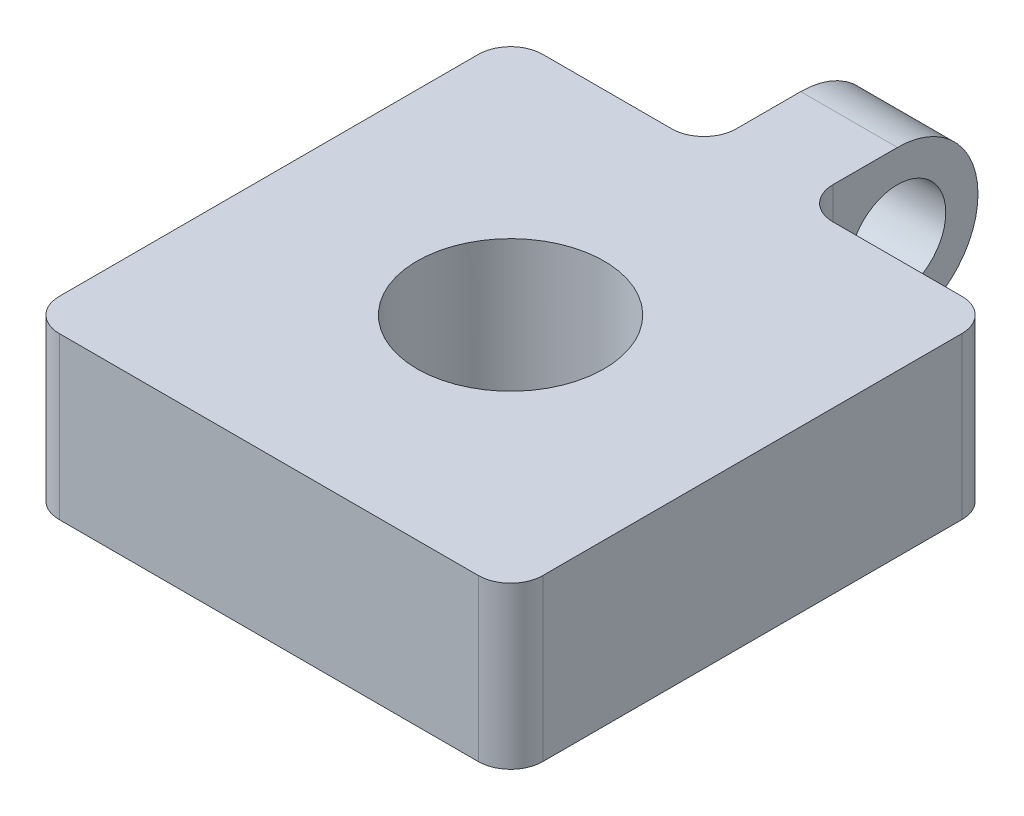
ISO-10303-21;
HEADER;
FILE_DESCRIPTION(('STEP AP214'),'2;1');
FILE_NAME('part.step','',(''),(''),'','','');
FILE_SCHEMA(('AUTOMOTIVE_DESIGN { 1 0 10303 214 1 1 1 1 }'));
ENDSEC;
DATA;
#1=APPLICATION_CONTEXT('core data for automotive mechanical design processes');
#2=APPLICATION_PROTOCOL_DEFINITION('international standard','automotive_design',2000,#1);
#3=PRODUCT_CONTEXT('',#1,'mechanical');
#4=PRODUCT('Part','Part','',(#3));
#5=PRODUCT_RELATED_PRODUCT_CATEGORY('part','',(#4));
#6=PRODUCT_DEFINITION_FORMATION('','',#4);
#7=PRODUCT_DEFINITION_CONTEXT('part definition',#1,'design');
#8=PRODUCT_DEFINITION('design','',#6,#7);
#9=PRODUCT_DEFINITION_SHAPE('','',#8);
#10=(LENGTH_UNIT() NAMED_UNIT(*) SI_UNIT(.MILLI.,.METRE.));
#11=(NAMED_UNIT(*) PLANE_ANGLE_UNIT() SI_UNIT($,.RADIAN.));
#12=(NAMED_UNIT(*) SI_UNIT($,.STERADIAN.) SOLID_ANGLE_UNIT());
#13=UNCERTAINTY_MEASURE_WITH_UNIT(LENGTH_MEASURE(1.E-05),#10,'distance_accuracy_value','');
#14=(GEOMETRIC_REPRESENTATION_CONTEXT(3) GLOBAL_UNCERTAINTY_ASSIGNED_CONTEXT((#13)) GLOBAL_UNIT_ASSIGNED_CONTEXT((#10,
#11,#12)) REPRESENTATION_CONTEXT('',''));
#15=CARTESIAN_POINT('',(0.,0.,0.));
#16=DIRECTION('',(0.,0.,1.));
#17=DIRECTION('',(1.,0.,0.));
#18=AXIS2_PLACEMENT_3D('',#15,#16,#17);
#19=CARTESIAN_POINT('',(-7.5,5.,-7.5));
#20=DIRECTION('',(0.,0.,1.));
#21=DIRECTION('',(1.,0.,0.));
#22=AXIS2_PLACEMENT_3D('',#19,#20,#21);
#23=PLANE('',#22);
#24=DIRECTION('',(-1.,0.,0.));
#25=VECTOR('',#24,1.);
#26=CARTESIAN_POINT('',(-7.5,5.,-7.5));
#27=LINE('',#26,#25);
#28=CARTESIAN_POINT('',(6.5,5.,-7.5));
#29=VERTEX_POINT('',#28);
#30=CARTESIAN_POINT('',(2.5,5.,-7.5));
#31=VERTEX_POINT('',#30);
#32=EDGE_CURVE('E183',#29,#31,#27,.T.);
#33=ORIENTED_EDGE('',*,*,#32,.F.);
#34=DIRECTION('',(0.,-1.,0.));
#35=VECTOR('',#34,1.);
#36=CARTESIAN_POINT('',(6.5,5.,-7.5));
#37=LINE('',#36,#35);
#38=CARTESIAN_POINT('',(6.5,0.,-7.5));
#39=VERTEX_POINT('',#38);
#40=EDGE_CURVE('E236',#29,#39,#37,.T.);
#41=ORIENTED_EDGE('',*,*,#40,.T.);
#42=DIRECTION('',(-1.,0.,0.));
#43=VECTOR('',#42,1.);
#44=CARTESIAN_POINT('',(-7.5,0.,-7.5));
#45=LINE('',#44,#43);
#46=CARTESIAN_POINT('',(2.5,0.,-7.5));
#47=VERTEX_POINT('',#46);
#48=EDGE_CURVE('E194',#39,#47,#45,.T.);
#49=ORIENTED_EDGE('',*,*,#48,.T.);
#50=DIRECTION('',(0.,-1.,0.));
#51=VECTOR('',#50,1.);
#52=CARTESIAN_POINT('',(2.5,5.,-7.5));
#53=LINE('',#52,#51);
#54=EDGE_CURVE('E234',#47,#31,#53,.F.);
#55=ORIENTED_EDGE('',*,*,#54,.T.);
#56=EDGE_LOOP('',(#33,#41,#49,#55));
#57=FACE_BOUND('',#56,.T.);
#58=ADVANCED_FACE('F37',(#57),#23,.F.);
#59=CARTESIAN_POINT('',(7.5,5.,7.5));
#60=DIRECTION('',(-1.,0.,0.));
#61=DIRECTION('',(0.,0.,1.));
#62=AXIS2_PLACEMENT_3D('',#59,#60,#61);
#63=PLANE('',#62);
#64=DIRECTION('',(0.,0.,-1.));
#65=VECTOR('',#64,1.);
#66=CARTESIAN_POINT('',(7.5,5.,7.5));
#67=LINE('',#66,#65);
#68=CARTESIAN_POINT('',(7.5,5.,6.5));
#69=VERTEX_POINT('',#68);
#70=CARTESIAN_POINT('',(7.5,5.,-6.5));
#71=VERTEX_POINT('',#70);
#72=EDGE_CURVE('E178',#69,#71,#67,.T.);
#73=ORIENTED_EDGE('',*,*,#72,.F.);
#74=DIRECTION('',(0.,-1.,0.));
#75=VECTOR('',#74,1.);
#76=CARTESIAN_POINT('',(7.5,5.,6.5));
#77=LINE('',#76,#75);
#78=CARTESIAN_POINT('',(7.5,0.,6.5));
#79=VERTEX_POINT('',#78);
#80=EDGE_CURVE('E231',#69,#79,#77,.T.);
#81=ORIENTED_EDGE('',*,*,#80,.T.);
#82=DIRECTION('',(0.,0.,-1.));
#83=VECTOR('',#82,1.);
#84=CARTESIAN_POINT('',(7.5,0.,7.5));
#85=LINE('',#84,#83);
#86=CARTESIAN_POINT('',(7.5,0.,-6.5));
#87=VERTEX_POINT('',#86);
#88=EDGE_CURVE('E160',#79,#87,#85,.T.);
#89=ORIENTED_EDGE('',*,*,#88,.T.);
#90=DIRECTION('',(0.,-1.,0.));
#91=VECTOR('',#90,1.);
#92=CARTESIAN_POINT('',(7.5,5.,-6.5));
#93=LINE('',#92,#91);
#94=EDGE_CURVE('E229',#87,#71,#93,.F.);
#95=ORIENTED_EDGE('',*,*,#94,.T.);
#96=EDGE_LOOP('',(#73,#81,#89,#95));
#97=FACE_BOUND('',#96,.T.);
#98=ADVANCED_FACE('F281',(#97),#63,.F.);
#99=CARTESIAN_POINT('',(-2.5,0.,-7.5));
#100=VERTEX_POINT('',#99);
#101=CARTESIAN_POINT('',(-6.5,0.,-7.5));
#102=VERTEX_POINT('',#101);
#103=EDGE_CURVE('E193',#100,#102,#45,.T.);
#104=ORIENTED_EDGE('',*,*,#103,.T.);
#105=DIRECTION('',(0.,-1.,0.));
#106=VECTOR('',#105,1.);
#107=CARTESIAN_POINT('',(-6.5,5.,-7.5));
#108=LINE('',#107,#106);
#109=CARTESIAN_POINT('',(-6.5,5.,-7.5));
#110=VERTEX_POINT('',#109);
#111=EDGE_CURVE('E216',#102,#110,#108,.F.);
#112=ORIENTED_EDGE('',*,*,#111,.T.);
#113=CARTESIAN_POINT('',(-2.5,5.,-7.5));
#114=VERTEX_POINT('',#113);
#115=EDGE_CURVE('E181',#114,#110,#27,.T.);
#116=ORIENTED_EDGE('',*,*,#115,.F.);
#117=DIRECTION('',(0.,-1.,0.));
#118=VECTOR('',#117,1.);
#119=CARTESIAN_POINT('',(-2.5,5.,-7.5));
#120=LINE('',#119,#118);
#121=EDGE_CURVE('E213',#114,#100,#120,.T.);
#122=ORIENTED_EDGE('',*,*,#121,.T.);
#123=EDGE_LOOP('',(#104,#112,#116,#122));
#124=FACE_BOUND('',#123,.T.);
#125=ADVANCED_FACE('F260',(#124),#23,.F.);
#126=CARTESIAN_POINT('',(-7.5,5.,7.5));
#127=DIRECTION('',(1.,0.,0.));
#128=DIRECTION('',(0.,0.,-1.));
#129=AXIS2_PLACEMENT_3D('',#126,#127,#128);
#130=PLANE('',#129);
#131=DIRECTION('',(0.,0.,1.));
#132=VECTOR('',#131,1.);
#133=CARTESIAN_POINT('',(-7.5,5.,7.5));
#134=LINE('',#133,#132);
#135=CARTESIAN_POINT('',(-7.5,5.,-6.5));
#136=VERTEX_POINT('',#135);
#137=CARTESIAN_POINT('',(-7.5,5.,6.5));
#138=VERTEX_POINT('',#137);
#139=EDGE_CURVE('E186',#136,#138,#134,.T.);
#140=ORIENTED_EDGE('',*,*,#139,.F.);
#141=DIRECTION('',(0.,-1.,0.));
#142=VECTOR('',#141,1.);
#143=CARTESIAN_POINT('',(-7.5,5.,-6.5));
#144=LINE('',#143,#142);
#145=CARTESIAN_POINT('',(-7.5,0.,-6.5));
#146=VERTEX_POINT('',#145);
#147=EDGE_CURVE('E202',#136,#146,#144,.T.);
#148=ORIENTED_EDGE('',*,*,#147,.T.);
#149=DIRECTION('',(0.,0.,1.));
#150=VECTOR('',#149,1.);
#151=CARTESIAN_POINT('',(-7.5,0.,7.5));
#152=LINE('',#151,#150);
#153=CARTESIAN_POINT('',(-7.5,0.,6.5));
#154=VERTEX_POINT('',#153);
#155=EDGE_CURVE('E197',#146,#154,#152,.T.);
#156=ORIENTED_EDGE('',*,*,#155,.T.);
#157=DIRECTION('',(0.,-1.,0.));
#158=VECTOR('',#157,1.);
#159=CARTESIAN_POINT('',(-7.5,5.,6.5));
#160=LINE('',#159,#158);
#161=EDGE_CURVE('E190',#154,#138,#160,.F.);
#162=ORIENTED_EDGE('',*,*,#161,.T.);
#163=EDGE_LOOP('',(#140,#148,#156,#162));
#164=FACE_BOUND('',#163,.T.);
#165=ADVANCED_FACE('F267',(#164),#130,.F.);
#166=CARTESIAN_POINT('',(-7.5,5.,7.5));
#167=DIRECTION('',(0.,0.,-1.));
#168=DIRECTION('',(-1.,0.,0.));
#169=AXIS2_PLACEMENT_3D('',#166,#167,#168);
#170=PLANE('',#169);
#171=DIRECTION('',(1.,0.,0.));
#172=VECTOR('',#171,1.);
#173=CARTESIAN_POINT('',(-7.5,5.,7.5));
#174=LINE('',#173,#172);
#175=CARTESIAN_POINT('',(-6.5,5.,7.5));
#176=VERTEX_POINT('',#175);
#177=CARTESIAN_POINT('',(6.5,5.,7.5));
#178=VERTEX_POINT('',#177);
#179=EDGE_CURVE('E188',#176,#178,#174,.T.);
#180=ORIENTED_EDGE('',*,*,#179,.F.);
#181=DIRECTION('',(0.,-1.,0.));
#182=VECTOR('',#181,1.);
#183=CARTESIAN_POINT('',(-6.5,5.,7.5));
#184=LINE('',#183,#182);
#185=CARTESIAN_POINT('',(-6.5,0.,7.5));
#186=VERTEX_POINT('',#185);
#187=EDGE_CURVE('E226',#176,#186,#184,.T.);
#188=ORIENTED_EDGE('',*,*,#187,.T.);
#189=DIRECTION('',(1.,0.,0.));
#190=VECTOR('',#189,1.);
#191=CARTESIAN_POINT('',(-7.5,0.,7.5));
#192=LINE('',#191,#190);
#193=CARTESIAN_POINT('',(6.5,0.,7.5));
#194=VERTEX_POINT('',#193);
#195=EDGE_CURVE('E182',#186,#194,#192,.T.);
#196=ORIENTED_EDGE('',*,*,#195,.T.);
#197=DIRECTION('',(0.,-1.,0.));
#198=VECTOR('',#197,1.);
#199=CARTESIAN_POINT('',(6.5,5.,7.5));
#200=LINE('',#199,#198);
#201=EDGE_CURVE('E52',#194,#178,#200,.F.);
#202=ORIENTED_EDGE('',*,*,#201,.T.);
#203=EDGE_LOOP('',(#180,#188,#196,#202));
#204=FACE_BOUND('',#203,.T.);
#205=ADVANCED_FACE('F273',(#204),#170,.F.);
#206=CARTESIAN_POINT('',(0.,5.,0.));
#207=DIRECTION('',(0.,-1.,0.));
#208=DIRECTION('',(0.,0.,-1.));
#209=AXIS2_PLACEMENT_3D('',#206,#207,#208);
#210=PLANE('',#209);
#211=CARTESIAN_POINT('',(0.,5.,0.));
#212=DIRECTION('',(0.,1.,0.));
#213=DIRECTION('',(0.,0.,1.));
#214=AXIS2_PLACEMENT_3D('',#211,#212,#213);
#215=CIRCLE('',#214,2.9);
#216=CARTESIAN_POINT('',(0.,5.,2.9));
#217=VERTEX_POINT('',#216);
#218=EDGE_CURVE('E345',#217,#217,#215,.T.);
#219=ORIENTED_EDGE('',*,*,#218,.F.);
#220=EDGE_LOOP('',(#219));
#221=FACE_BOUND('',#220,.T.);
#222=ORIENTED_EDGE('',*,*,#115,.T.);
#223=CARTESIAN_POINT('',(-6.5,5.,-6.5));
#224=DIRECTION('',(0.,-1.,0.));
#225=DIRECTION('',(0.,0.,-1.));
#226=AXIS2_PLACEMENT_3D('',#223,#224,#225);
#227=CIRCLE('',#226,1.);
#228=EDGE_CURVE('E223',#110,#136,#227,.F.);
#229=ORIENTED_EDGE('',*,*,#228,.T.);
#230=ORIENTED_EDGE('',*,*,#139,.T.);
#231=CARTESIAN_POINT('',(-6.5,5.,6.5));
#232=DIRECTION('',(0.,-1.,0.));
#233=DIRECTION('',(0.,0.,-1.));
#234=AXIS2_PLACEMENT_3D('',#231,#232,#233);
#235=CIRCLE('',#234,1.);
#236=EDGE_CURVE('E59',#138,#176,#235,.F.);
#237=ORIENTED_EDGE('',*,*,#236,.T.);
#238=ORIENTED_EDGE('',*,*,#179,.T.);
#239=CARTESIAN_POINT('',(6.5,5.,6.5));
#240=DIRECTION('',(0.,-1.,0.));
#241=DIRECTION('',(0.,0.,-1.));
#242=AXIS2_PLACEMENT_3D('',#239,#240,#241);
#243=CIRCLE('',#242,1.);
#244=EDGE_CURVE('E220',#178,#69,#243,.F.);
#245=ORIENTED_EDGE('',*,*,#244,.T.);
#246=ORIENTED_EDGE('',*,*,#72,.T.);
#247=CARTESIAN_POINT('',(6.5,5.,-6.5));
#248=DIRECTION('',(0.,-1.,0.));
#249=DIRECTION('',(0.,0.,-1.));
#250=AXIS2_PLACEMENT_3D('',#247,#248,#249);
#251=CIRCLE('',#250,1.);
#252=EDGE_CURVE('E218',#71,#29,#251,.F.);
#253=ORIENTED_EDGE('',*,*,#252,.T.);
#254=ORIENTED_EDGE('',*,*,#32,.T.);
#255=CARTESIAN_POINT('',(2.5,5.,-8.5));
#256=DIRECTION('',(0.,-1.,0.));
#257=DIRECTION('',(0.,0.,-1.));
#258=AXIS2_PLACEMENT_3D('',#255,#256,#257);
#259=CIRCLE('',#258,1.);
#260=CARTESIAN_POINT('',(1.5,5.,-8.5));
#261=VERTEX_POINT('',#260);
#262=EDGE_CURVE('E244',#31,#261,#259,.T.);
#263=ORIENTED_EDGE('',*,*,#262,.T.);
#264=DIRECTION('',(0.,0.,1.));
#265=VECTOR('',#264,1.);
#266=CARTESIAN_POINT('',(1.5,5.,-7.5));
#267=LINE('',#266,#265);
#268=CARTESIAN_POINT('',(1.5,5.,-10.5));
#269=VERTEX_POINT('',#268);
#270=EDGE_CURVE('E166',#269,#261,#267,.T.);
#271=ORIENTED_EDGE('',*,*,#270,.F.);
#272=DIRECTION('',(-1.,0.,0.));
#273=VECTOR('',#272,1.);
#274=CARTESIAN_POINT('',(1.5,5.,-10.5));
#275=LINE('',#274,#273);
#276=CARTESIAN_POINT('',(-1.5,5.,-10.5));
#277=VERTEX_POINT('',#276);
#278=EDGE_CURVE('E161',#269,#277,#275,.T.);
#279=ORIENTED_EDGE('',*,*,#278,.T.);
#280=DIRECTION('',(0.,0.,1.));
#281=VECTOR('',#280,1.);
#282=CARTESIAN_POINT('',(-1.5,5.,-7.5));
#283=LINE('',#282,#281);
#284=CARTESIAN_POINT('',(-1.5,5.,-8.5));
#285=VERTEX_POINT('',#284);
#286=EDGE_CURVE('E150',#277,#285,#283,.T.);
#287=ORIENTED_EDGE('',*,*,#286,.T.);
#288=CARTESIAN_POINT('',(-2.5,5.,-8.5));
#289=DIRECTION('',(0.,-1.,0.));
#290=DIRECTION('',(0.,0.,-1.));
#291=AXIS2_PLACEMENT_3D('',#288,#289,#290);
#292=CIRCLE('',#291,1.);
#293=EDGE_CURVE('E11',#285,#114,#292,.T.);
#294=ORIENTED_EDGE('',*,*,#293,.T.);
#295=EDGE_LOOP('',(#222,#229,#230,#237,#238,#245,#246,#253,#254,#263,#271,#279,#287,#294));
#296=FACE_BOUND('',#295,.T.);
#297=ADVANCED_FACE('F257',(#221,#296),#210,.F.);
#298=CARTESIAN_POINT('',(0.,0.,0.));
#299=DIRECTION('',(0.,-1.,0.));
#300=DIRECTION('',(0.,0.,-1.));
#301=AXIS2_PLACEMENT_3D('',#298,#299,#300);
#302=PLANE('',#301);
#303=CARTESIAN_POINT('',(0.,0.,0.));
#304=DIRECTION('',(0.,-1.,0.));
#305=DIRECTION('',(0.,0.,-1.));
#306=AXIS2_PLACEMENT_3D('',#303,#304,#305);
#307=CIRCLE('',#306,2.9);
#308=CARTESIAN_POINT('',(0.,0.,-2.9));
#309=VERTEX_POINT('',#308);
#310=EDGE_CURVE('E342',#309,#309,#307,.F.);
#311=ORIENTED_EDGE('',*,*,#310,.T.);
#312=EDGE_LOOP('',(#311));
#313=FACE_BOUND('',#312,.T.);
#314=ORIENTED_EDGE('',*,*,#155,.F.);
#315=CARTESIAN_POINT('',(-6.5,0.,-6.5));
#316=DIRECTION('',(0.,-1.,0.));
#317=DIRECTION('',(0.,0.,-1.));
#318=AXIS2_PLACEMENT_3D('',#315,#316,#317);
#319=CIRCLE('',#318,1.);
#320=EDGE_CURVE('E211',#146,#102,#319,.T.);
#321=ORIENTED_EDGE('',*,*,#320,.T.);
#322=ORIENTED_EDGE('',*,*,#103,.F.);
#323=CARTESIAN_POINT('',(-2.5,0.,-8.5));
#324=DIRECTION('',(0.,-1.,0.));
#325=DIRECTION('',(0.,0.,-1.));
#326=AXIS2_PLACEMENT_3D('',#323,#324,#325);
#327=CIRCLE('',#326,1.);
#328=CARTESIAN_POINT('',(-1.5,0.,-8.5));
#329=VERTEX_POINT('',#328);
#330=EDGE_CURVE('E45',#100,#329,#327,.F.);
#331=ORIENTED_EDGE('',*,*,#330,.T.);
#332=DIRECTION('',(0.,0.,-1.));
#333=VECTOR('',#332,1.);
#334=CARTESIAN_POINT('',(-1.5,0.,-7.5));
#335=LINE('',#334,#333);
#336=CARTESIAN_POINT('',(-1.5,0.,-10.5));
#337=VERTEX_POINT('',#336);
#338=EDGE_CURVE('E157',#329,#337,#335,.T.);
#339=ORIENTED_EDGE('',*,*,#338,.T.);
#340=DIRECTION('',(-1.,0.,0.));
#341=VECTOR('',#340,1.);
#342=CARTESIAN_POINT('',(1.5,0.,-10.5));
#343=LINE('',#342,#341);
#344=CARTESIAN_POINT('',(1.5,0.,-10.5));
#345=VERTEX_POINT('',#344);
#346=EDGE_CURVE('E153',#345,#337,#343,.T.);
#347=ORIENTED_EDGE('',*,*,#346,.F.);
#348=DIRECTION('',(0.,0.,-1.));
#349=VECTOR('',#348,1.);
#350=CARTESIAN_POINT('',(1.5,0.,-7.5));
#351=LINE('',#350,#349);
#352=CARTESIAN_POINT('',(1.5,0.,-8.5));
#353=VERTEX_POINT('',#352);
#354=EDGE_CURVE('E139',#353,#345,#351,.T.);
#355=ORIENTED_EDGE('',*,*,#354,.F.);
#356=CARTESIAN_POINT('',(2.5,0.,-8.5));
#357=DIRECTION('',(0.,-1.,0.));
#358=DIRECTION('',(0.,0.,-1.));
#359=AXIS2_PLACEMENT_3D('',#356,#357,#358);
#360=CIRCLE('',#359,1.);
#361=EDGE_CURVE('E242',#353,#47,#360,.F.);
#362=ORIENTED_EDGE('',*,*,#361,.T.);
#363=ORIENTED_EDGE('',*,*,#48,.F.);
#364=CARTESIAN_POINT('',(6.5,0.,-6.5));
#365=DIRECTION('',(0.,-1.,0.));
#366=DIRECTION('',(0.,0.,-1.));
#367=AXIS2_PLACEMENT_3D('',#364,#365,#366);
#368=CIRCLE('',#367,1.);
#369=EDGE_CURVE('E205',#39,#87,#368,.T.);
#370=ORIENTED_EDGE('',*,*,#369,.T.);
#371=ORIENTED_EDGE('',*,*,#88,.F.);
#372=CARTESIAN_POINT('',(6.5,0.,6.5));
#373=DIRECTION('',(0.,-1.,0.));
#374=DIRECTION('',(0.,0.,-1.));
#375=AXIS2_PLACEMENT_3D('',#372,#373,#374);
#376=CIRCLE('',#375,1.);
#377=EDGE_CURVE('E207',#79,#194,#376,.T.);
#378=ORIENTED_EDGE('',*,*,#377,.T.);
#379=ORIENTED_EDGE('',*,*,#195,.F.);
#380=CARTESIAN_POINT('',(-6.5,0.,6.5));
#381=DIRECTION('',(0.,-1.,0.));
#382=DIRECTION('',(0.,0.,-1.));
#383=AXIS2_PLACEMENT_3D('',#380,#381,#382);
#384=CIRCLE('',#383,1.);
#385=EDGE_CURVE('E209',#186,#154,#384,.T.);
#386=ORIENTED_EDGE('',*,*,#385,.T.);
#387=EDGE_LOOP('',(#314,#321,#322,#331,#339,#347,#355,#362,#363,#370,#371,#378,#379,#386));
#388=FACE_BOUND('',#387,.T.);
#389=ADVANCED_FACE('F155',(#313,#388),#302,.T.);
#390=CARTESIAN_POINT('',(1.5,2.5,-10.5));
#391=DIRECTION('',(-1.,0.,0.));
#392=DIRECTION('',(0.,0.,1.));
#393=AXIS2_PLACEMENT_3D('',#390,#391,#392);
#394=PLANE('',#393);
#395=ORIENTED_EDGE('',*,*,#270,.T.);
#396=DIRECTION('',(0.,-1.,0.));
#397=VECTOR('',#396,1.);
#398=CARTESIAN_POINT('',(1.5,0.,-8.5));
#399=LINE('',#398,#397);
#400=EDGE_CURVE('E148',#261,#353,#399,.T.);
#401=ORIENTED_EDGE('',*,*,#400,.T.);
#402=ORIENTED_EDGE('',*,*,#354,.T.);
#403=CARTESIAN_POINT('',(1.5,2.5,-10.5));
#404=DIRECTION('',(1.,0.,0.));
#405=DIRECTION('',(0.,0.,1.));
#406=AXIS2_PLACEMENT_3D('',#403,#404,#405);
#407=CIRCLE('',#406,2.5);
#408=EDGE_CURVE('E145',#345,#269,#407,.T.);
#409=ORIENTED_EDGE('',*,*,#408,.T.);
#410=EDGE_LOOP('',(#395,#401,#402,#409));
#411=FACE_BOUND('',#410,.T.);
#412=CARTESIAN_POINT('',(1.5,2.5,-10.5));
#413=DIRECTION('',(1.,0.,0.));
#414=DIRECTION('',(0.,0.,-1.));
#415=AXIS2_PLACEMENT_3D('',#412,#413,#414);
#416=CIRCLE('',#415,1.5);
#417=CARTESIAN_POINT('',(1.5,2.5,-12.));
#418=VERTEX_POINT('',#417);
#419=EDGE_CURVE('E173',#418,#418,#416,.T.);
#420=ORIENTED_EDGE('',*,*,#419,.F.);
#421=EDGE_LOOP('',(#420));
#422=FACE_BOUND('',#421,.T.);
#423=ADVANCED_FACE('F142',(#411,#422),#394,.F.);
#424=CARTESIAN_POINT('',(-1.5,2.5,-10.5));
#425=DIRECTION('',(-1.,0.,0.));
#426=DIRECTION('',(0.,0.,1.));
#427=AXIS2_PLACEMENT_3D('',#424,#425,#426);
#428=PLANE('',#427);
#429=ORIENTED_EDGE('',*,*,#338,.F.);
#430=DIRECTION('',(0.,-1.,0.));
#431=VECTOR('',#430,1.);
#432=CARTESIAN_POINT('',(-1.5,2.5,-8.5));
#433=LINE('',#432,#431);
#434=EDGE_CURVE('E240',#329,#285,#433,.F.);
#435=ORIENTED_EDGE('',*,*,#434,.T.);
#436=ORIENTED_EDGE('',*,*,#286,.F.);
#437=CARTESIAN_POINT('',(-1.5,2.5,-10.5));
#438=DIRECTION('',(1.,0.,0.));
#439=DIRECTION('',(0.,0.,1.));
#440=AXIS2_PLACEMENT_3D('',#437,#438,#439);
#441=CIRCLE('',#440,2.5);
#442=EDGE_CURVE('E172',#337,#277,#441,.T.);
#443=ORIENTED_EDGE('',*,*,#442,.F.);
#444=EDGE_LOOP('',(#429,#435,#436,#443));
#445=FACE_BOUND('',#444,.T.);
#446=CARTESIAN_POINT('',(-1.5,2.5,-10.5));
#447=DIRECTION('',(1.,0.,0.));
#448=DIRECTION('',(0.,0.,-1.));
#449=AXIS2_PLACEMENT_3D('',#446,#447,#448);
#450=CIRCLE('',#449,1.5);
#451=CARTESIAN_POINT('',(-1.5,2.5,-12.));
#452=VERTEX_POINT('',#451);
#453=EDGE_CURVE('E346',#452,#452,#450,.T.);
#454=ORIENTED_EDGE('',*,*,#453,.T.);
#455=EDGE_LOOP('',(#454));
#456=FACE_BOUND('',#455,.T.);
#457=ADVANCED_FACE('F251',(#445,#456),#428,.T.);
#458=CARTESIAN_POINT('',(1.5,2.5,-10.5));
#459=DIRECTION('',(-1.,0.,0.));
#460=DIRECTION('',(0.,0.,1.));
#461=AXIS2_PLACEMENT_3D('',#458,#459,#460);
#462=CYLINDRICAL_SURFACE('',#461,2.5);
#463=ORIENTED_EDGE('',*,*,#442,.T.);
#464=ORIENTED_EDGE('',*,*,#278,.F.);
#465=ORIENTED_EDGE('',*,*,#408,.F.);
#466=ORIENTED_EDGE('',*,*,#346,.T.);
#467=EDGE_LOOP('',(#463,#464,#465,#466));
#468=FACE_BOUND('',#467,.T.);
#469=ADVANCED_FACE('F163',(#468),#462,.T.);
#470=CARTESIAN_POINT('',(1.5,2.5,-10.5));
#471=DIRECTION('',(-1.,0.,0.));
#472=DIRECTION('',(0.,0.,1.));
#473=AXIS2_PLACEMENT_3D('',#470,#471,#472);
#474=CYLINDRICAL_SURFACE('',#473,1.5);
#475=ORIENTED_EDGE('',*,*,#419,.T.);
#476=EDGE_LOOP('',(#475));
#477=FACE_BOUND('',#476,.T.);
#478=ORIENTED_EDGE('',*,*,#453,.F.);
#479=EDGE_LOOP('',(#478));
#480=FACE_BOUND('',#479,.T.);
#481=ADVANCED_FACE('F324',(#477,#480),#474,.F.);
#482=CARTESIAN_POINT('',(0.,-0.00100000000000013,0.));
#483=DIRECTION('',(0.,1.,0.));
#484=DIRECTION('',(0.,0.,1.));
#485=AXIS2_PLACEMENT_3D('',#482,#483,#484);
#486=CYLINDRICAL_SURFACE('',#485,2.9);
#487=ORIENTED_EDGE('',*,*,#310,.F.);
#488=EDGE_LOOP('',(#487));
#489=FACE_BOUND('',#488,.T.);
#490=ORIENTED_EDGE('',*,*,#218,.T.);
#491=EDGE_LOOP('',(#490));
#492=FACE_BOUND('',#491,.T.);
#493=ADVANCED_FACE('F331',(#489,#492),#486,.F.);
#494=CARTESIAN_POINT('',(-6.5,5.,-6.5));
#495=DIRECTION('',(0.,-1.,0.));
#496=DIRECTION('',(0.,0.,-1.));
#497=AXIS2_PLACEMENT_3D('',#494,#495,#496);
#498=CYLINDRICAL_SURFACE('',#497,1.);
#499=ORIENTED_EDGE('',*,*,#228,.F.);
#500=ORIENTED_EDGE('',*,*,#111,.F.);
#501=ORIENTED_EDGE('',*,*,#320,.F.);
#502=ORIENTED_EDGE('',*,*,#147,.F.);
#503=EDGE_LOOP('',(#499,#500,#501,#502));
#504=FACE_BOUND('',#503,.T.);
#505=ADVANCED_FACE('F263',(#504),#498,.T.);
#506=CARTESIAN_POINT('',(-6.5,5.,6.5));
#507=DIRECTION('',(0.,-1.,0.));
#508=DIRECTION('',(0.,0.,-1.));
#509=AXIS2_PLACEMENT_3D('',#506,#507,#508);
#510=CYLINDRICAL_SURFACE('',#509,1.);
#511=ORIENTED_EDGE('',*,*,#236,.F.);
#512=ORIENTED_EDGE('',*,*,#161,.F.);
#513=ORIENTED_EDGE('',*,*,#385,.F.);
#514=ORIENTED_EDGE('',*,*,#187,.F.);
#515=EDGE_LOOP('',(#511,#512,#513,#514));
#516=FACE_BOUND('',#515,.T.);
#517=ADVANCED_FACE('F270',(#516),#510,.T.);
#518=CARTESIAN_POINT('',(6.5,5.,6.5));
#519=DIRECTION('',(0.,-1.,0.));
#520=DIRECTION('',(0.,0.,-1.));
#521=AXIS2_PLACEMENT_3D('',#518,#519,#520);
#522=CYLINDRICAL_SURFACE('',#521,1.);
#523=ORIENTED_EDGE('',*,*,#244,.F.);
#524=ORIENTED_EDGE('',*,*,#201,.F.);
#525=ORIENTED_EDGE('',*,*,#377,.F.);
#526=ORIENTED_EDGE('',*,*,#80,.F.);
#527=EDGE_LOOP('',(#523,#524,#525,#526));
#528=FACE_BOUND('',#527,.T.);
#529=ADVANCED_FACE('F278',(#528),#522,.T.);
#530=CARTESIAN_POINT('',(6.5,5.,-6.5));
#531=DIRECTION('',(0.,-1.,0.));
#532=DIRECTION('',(0.,0.,-1.));
#533=AXIS2_PLACEMENT_3D('',#530,#531,#532);
#534=CYLINDRICAL_SURFACE('',#533,1.);
#535=ORIENTED_EDGE('',*,*,#252,.F.);
#536=ORIENTED_EDGE('',*,*,#94,.F.);
#537=ORIENTED_EDGE('',*,*,#369,.F.);
#538=ORIENTED_EDGE('',*,*,#40,.F.);
#539=EDGE_LOOP('',(#535,#536,#537,#538));
#540=FACE_BOUND('',#539,.T.);
#541=ADVANCED_FACE('F287',(#540),#534,.T.);
#542=CARTESIAN_POINT('',(2.5,2.5,-8.5));
#543=DIRECTION('',(0.,1.,0.));
#544=DIRECTION('',(0.,0.,1.));
#545=AXIS2_PLACEMENT_3D('',#542,#543,#544);
#546=CYLINDRICAL_SURFACE('',#545,1.);
#547=ORIENTED_EDGE('',*,*,#262,.F.);
#548=ORIENTED_EDGE('',*,*,#54,.F.);
#549=ORIENTED_EDGE('',*,*,#361,.F.);
#550=ORIENTED_EDGE('',*,*,#400,.F.);
#551=EDGE_LOOP('',(#547,#548,#549,#550));
#552=FACE_BOUND('',#551,.T.);
#553=ADVANCED_FACE('F293',(#552),#546,.F.);
#554=CARTESIAN_POINT('',(-2.5,5.,-8.5));
#555=DIRECTION('',(0.,-1.,0.));
#556=DIRECTION('',(0.,0.,-1.));
#557=AXIS2_PLACEMENT_3D('',#554,#555,#556);
#558=CYLINDRICAL_SURFACE('',#557,1.);
#559=ORIENTED_EDGE('',*,*,#293,.F.);
#560=ORIENTED_EDGE('',*,*,#434,.F.);
#561=ORIENTED_EDGE('',*,*,#330,.F.);
#562=ORIENTED_EDGE('',*,*,#121,.F.);
#563=EDGE_LOOP('',(#559,#560,#561,#562));
#564=FACE_BOUND('',#563,.T.);
#565=ADVANCED_FACE('F39',(#564),#558,.F.);
#566=CLOSED_SHELL('',(#58,#98,#125,#165,#205,#297,#389,#423,#457,#469,#481,#493,#505,#517,#529,
#541,#553,#565));
#567=MANIFOLD_SOLID_BREP('B2',#566);
#568=ADVANCED_BREP_SHAPE_REPRESENTATION('',(#18,#567),#14);
#569=SHAPE_DEFINITION_REPRESENTATION(#9,#568);
ENDSEC;
END-ISO-10303-21;
